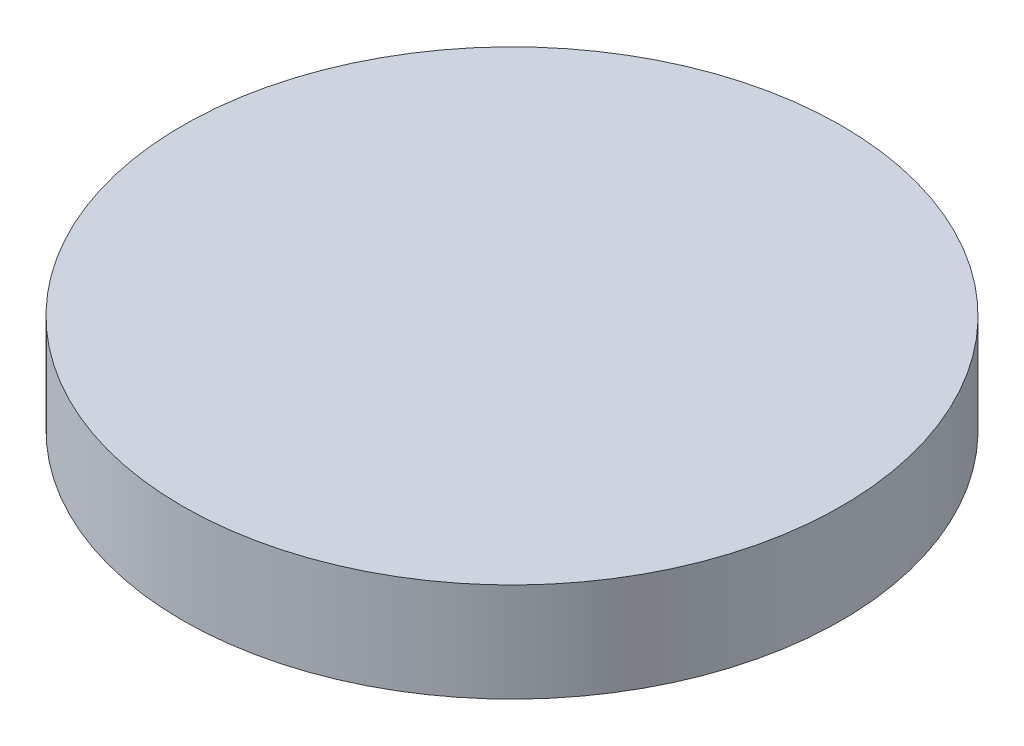
ISO-10303-21;
HEADER;
FILE_DESCRIPTION(('STEP AP214'),'2;1');
FILE_NAME('part.step','',(''),(''),'','','');
FILE_SCHEMA(('AUTOMOTIVE_DESIGN { 1 0 10303 214 1 1 1 1 }'));
ENDSEC;
DATA;
#1=APPLICATION_CONTEXT('core data for automotive mechanical design processes');
#2=APPLICATION_PROTOCOL_DEFINITION('international standard','automotive_design',2000,#1);
#3=PRODUCT_CONTEXT('',#1,'mechanical');
#4=PRODUCT('Part','Part','',(#3));
#5=PRODUCT_RELATED_PRODUCT_CATEGORY('part','',(#4));
#6=PRODUCT_DEFINITION_FORMATION('','',#4);
#7=PRODUCT_DEFINITION_CONTEXT('part definition',#1,'design');
#8=PRODUCT_DEFINITION('design','',#6,#7);
#9=PRODUCT_DEFINITION_SHAPE('','',#8);
#10=(LENGTH_UNIT() NAMED_UNIT(*) SI_UNIT(.MILLI.,.METRE.));
#11=(NAMED_UNIT(*) PLANE_ANGLE_UNIT() SI_UNIT($,.RADIAN.));
#12=(NAMED_UNIT(*) SI_UNIT($,.STERADIAN.) SOLID_ANGLE_UNIT());
#13=UNCERTAINTY_MEASURE_WITH_UNIT(LENGTH_MEASURE(1.E-05),#10,'distance_accuracy_value','');
#14=(GEOMETRIC_REPRESENTATION_CONTEXT(3) GLOBAL_UNCERTAINTY_ASSIGNED_CONTEXT((#13)) GLOBAL_UNIT_ASSIGNED_CONTEXT((#10,
#11,#12)) REPRESENTATION_CONTEXT('',''));
#15=CARTESIAN_POINT('',(0.,0.,0.));
#16=DIRECTION('',(0.,0.,1.));
#17=DIRECTION('',(1.,0.,0.));
#18=AXIS2_PLACEMENT_3D('',#15,#16,#17);
#19=CARTESIAN_POINT('',(0.,18.,0.));
#20=DIRECTION('',(0.,-1.,0.));
#21=DIRECTION('',(0.,0.,-1.));
#22=AXIS2_PLACEMENT_3D('',#19,#20,#21);
#23=CYLINDRICAL_SURFACE('',#22,60.);
#24=CARTESIAN_POINT('',(0.,18.,0.));
#25=DIRECTION('',(0.,1.,0.));
#26=DIRECTION('',(0.,0.,1.));
#27=AXIS2_PLACEMENT_3D('',#24,#25,#26);
#28=CIRCLE('',#27,60.);
#29=CARTESIAN_POINT('',(0.,18.,60.));
#30=VERTEX_POINT('',#29);
#31=EDGE_CURVE('E10',#30,#30,#28,.T.);
#32=ORIENTED_EDGE('',*,*,#31,.F.);
#33=EDGE_LOOP('',(#32));
#34=FACE_BOUND('',#33,.T.);
#35=CARTESIAN_POINT('',(0.,0.,0.));
#36=DIRECTION('',(0.,1.,0.));
#37=DIRECTION('',(0.,0.,1.));
#38=AXIS2_PLACEMENT_3D('',#35,#36,#37);
#39=CIRCLE('',#38,60.);
#40=CARTESIAN_POINT('',(0.,0.,60.));
#41=VERTEX_POINT('',#40);
#42=EDGE_CURVE('E33',#41,#41,#39,.T.);
#43=ORIENTED_EDGE('',*,*,#42,.T.);
#44=EDGE_LOOP('',(#43));
#45=FACE_BOUND('',#44,.T.);
#46=ADVANCED_FACE('F30',(#34,#45),#23,.T.);
#47=CARTESIAN_POINT('',(0.,18.,0.));
#48=DIRECTION('',(0.,1.,0.));
#49=DIRECTION('',(0.,0.,1.));
#50=AXIS2_PLACEMENT_3D('',#47,#48,#49);
#51=PLANE('',#50);
#52=ORIENTED_EDGE('',*,*,#31,.T.);
#53=EDGE_LOOP('',(#52));
#54=FACE_BOUND('',#53,.T.);
#55=ADVANCED_FACE('F45',(#54),#51,.T.);
#56=CARTESIAN_POINT('',(0.,0.,0.));
#57=DIRECTION('',(0.,1.,0.));
#58=DIRECTION('',(0.,0.,1.));
#59=AXIS2_PLACEMENT_3D('',#56,#57,#58);
#60=PLANE('',#59);
#61=ORIENTED_EDGE('',*,*,#42,.F.);
#62=EDGE_LOOP('',(#61));
#63=FACE_BOUND('',#62,.T.);
#64=ADVANCED_FACE('F43',(#63),#60,.F.);
#65=CLOSED_SHELL('',(#46,#55,#64));
#66=MANIFOLD_SOLID_BREP('B2',#65);
#67=ADVANCED_BREP_SHAPE_REPRESENTATION('',(#18,#66),#14);
#68=SHAPE_DEFINITION_REPRESENTATION(#9,#67);
ENDSEC;
END-ISO-10303-21;
